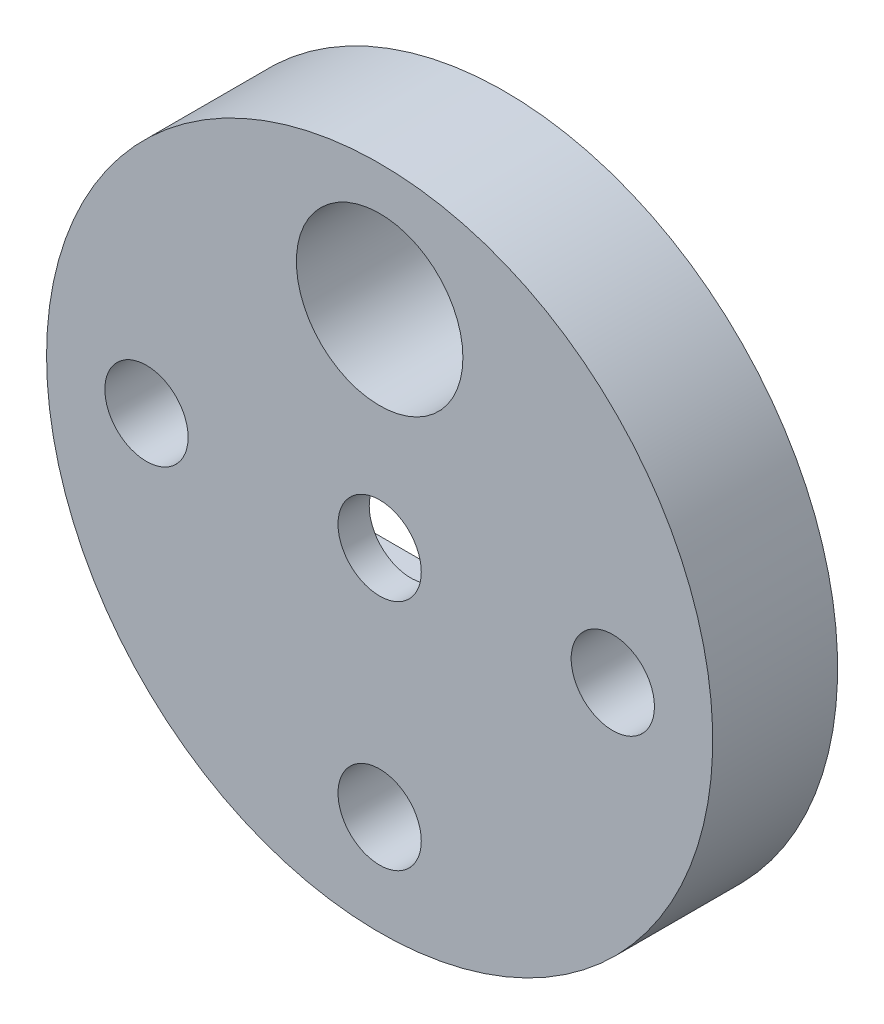
ISO-10303-21;
HEADER;
FILE_DESCRIPTION(('STEP AP214'),'2;1');
FILE_NAME('part.step','',(''),(''),'','','');
FILE_SCHEMA(('AUTOMOTIVE_DESIGN { 1 0 10303 214 1 1 1 1 }'));
ENDSEC;
DATA;
#1=APPLICATION_CONTEXT('core data for automotive mechanical design processes');
#2=APPLICATION_PROTOCOL_DEFINITION('international standard','automotive_design',2000,#1);
#3=PRODUCT_CONTEXT('',#1,'mechanical');
#4=PRODUCT('Part','Part','',(#3));
#5=PRODUCT_RELATED_PRODUCT_CATEGORY('part','',(#4));
#6=PRODUCT_DEFINITION_FORMATION('','',#4);
#7=PRODUCT_DEFINITION_CONTEXT('part definition',#1,'design');
#8=PRODUCT_DEFINITION('design','',#6,#7);
#9=PRODUCT_DEFINITION_SHAPE('','',#8);
#10=(LENGTH_UNIT() NAMED_UNIT(*) SI_UNIT(.MILLI.,.METRE.));
#11=(NAMED_UNIT(*) PLANE_ANGLE_UNIT() SI_UNIT($,.RADIAN.));
#12=(NAMED_UNIT(*) SI_UNIT($,.STERADIAN.) SOLID_ANGLE_UNIT());
#13=UNCERTAINTY_MEASURE_WITH_UNIT(LENGTH_MEASURE(1.E-05),#10,'distance_accuracy_value','');
#14=(GEOMETRIC_REPRESENTATION_CONTEXT(3) GLOBAL_UNCERTAINTY_ASSIGNED_CONTEXT((#13)) GLOBAL_UNIT_ASSIGNED_CONTEXT((#10,
#11,#12)) REPRESENTATION_CONTEXT('',''));
#15=CARTESIAN_POINT('',(0.,0.,0.));
#16=DIRECTION('',(0.,0.,1.));
#17=DIRECTION('',(1.,0.,0.));
#18=AXIS2_PLACEMENT_3D('',#15,#16,#17);
#19=CARTESIAN_POINT('',(0.,0.,0.));
#20=DIRECTION('',(0.,0.,1.));
#21=DIRECTION('',(1.,0.,0.));
#22=AXIS2_PLACEMENT_3D('',#19,#20,#21);
#23=PLANE('',#22);
#24=CARTESIAN_POINT('',(-17.78,0.,0.));
#25=DIRECTION('',(0.,0.,1.));
#26=DIRECTION('',(1.,0.,0.));
#27=AXIS2_PLACEMENT_3D('',#24,#25,#26);
#28=CIRCLE('',#27,3.175);
#29=CARTESIAN_POINT('',(-14.605,0.,0.));
#30=VERTEX_POINT('',#29);
#31=EDGE_CURVE('E198',#30,#30,#28,.T.);
#32=ORIENTED_EDGE('',*,*,#31,.T.);
#33=EDGE_LOOP('',(#32));
#34=FACE_BOUND('',#33,.T.);
#35=CARTESIAN_POINT('',(0.,15.748,0.));
#36=DIRECTION('',(0.,0.,1.));
#37=DIRECTION('',(1.,0.,0.));
#38=AXIS2_PLACEMENT_3D('',#35,#36,#37);
#39=CIRCLE('',#38,6.35);
#40=CARTESIAN_POINT('',(6.35,15.748,0.));
#41=VERTEX_POINT('',#40);
#42=EDGE_CURVE('E202',#41,#41,#39,.T.);
#43=ORIENTED_EDGE('',*,*,#42,.T.);
#44=EDGE_LOOP('',(#43));
#45=FACE_BOUND('',#44,.T.);
#46=CARTESIAN_POINT('',(17.78,0.,0.));
#47=DIRECTION('',(0.,0.,1.));
#48=DIRECTION('',(1.,0.,0.));
#49=AXIS2_PLACEMENT_3D('',#46,#47,#48);
#50=CIRCLE('',#49,3.175);
#51=CARTESIAN_POINT('',(20.955,0.,0.));
#52=VERTEX_POINT('',#51);
#53=EDGE_CURVE('E206',#52,#52,#50,.T.);
#54=ORIENTED_EDGE('',*,*,#53,.T.);
#55=EDGE_LOOP('',(#54));
#56=FACE_BOUND('',#55,.T.);
#57=CARTESIAN_POINT('',(0.,-17.7688972694278,0.));
#58=DIRECTION('',(0.,0.,1.));
#59=DIRECTION('',(1.,0.,0.));
#60=AXIS2_PLACEMENT_3D('',#57,#58,#59);
#61=CIRCLE('',#60,3.175);
#62=CARTESIAN_POINT('',(3.175,-17.7688972694278,0.));
#63=VERTEX_POINT('',#62);
#64=EDGE_CURVE('E189',#63,#63,#61,.T.);
#65=ORIENTED_EDGE('',*,*,#64,.T.);
#66=EDGE_LOOP('',(#65));
#67=FACE_BOUND('',#66,.T.);
#68=CARTESIAN_POINT('',(0.,0.,0.));
#69=DIRECTION('',(0.,0.,1.));
#70=DIRECTION('',(1.,0.,0.));
#71=AXIS2_PLACEMENT_3D('',#68,#69,#70);
#72=CIRCLE('',#71,25.4);
#73=CARTESIAN_POINT('',(-25.4,0.,0.));
#74=VERTEX_POINT('',#73);
#75=EDGE_CURVE('E43',#74,#74,#72,.T.);
#76=ORIENTED_EDGE('',*,*,#75,.F.);
#77=EDGE_LOOP('',(#76));
#78=FACE_BOUND('',#77,.T.);
#79=DIRECTION('',(0.,-1.,0.));
#80=VECTOR('',#79,1.);
#81=CARTESIAN_POINT('',(-10.31875,8.73125,0.));
#82=LINE('',#81,#80);
#83=CARTESIAN_POINT('',(-10.31875,8.73125,0.));
#84=VERTEX_POINT('',#83);
#85=CARTESIAN_POINT('',(-10.31875,-8.73125,0.));
#86=VERTEX_POINT('',#85);
#87=EDGE_CURVE('E55',#84,#86,#82,.T.);
#88=ORIENTED_EDGE('',*,*,#87,.T.);
#89=DIRECTION('',(1.,0.,0.));
#90=VECTOR('',#89,1.);
#91=CARTESIAN_POINT('',(-10.31875,-8.73125,0.));
#92=LINE('',#91,#90);
#93=CARTESIAN_POINT('',(10.31875,-8.73125,0.));
#94=VERTEX_POINT('',#93);
#95=EDGE_CURVE('E114',#86,#94,#92,.T.);
#96=ORIENTED_EDGE('',*,*,#95,.T.);
#97=DIRECTION('',(0.,-1.,0.));
#98=VECTOR('',#97,1.);
#99=CARTESIAN_POINT('',(10.31875,8.73125,0.));
#100=LINE('',#99,#98);
#101=CARTESIAN_POINT('',(10.31875,8.73125,0.));
#102=VERTEX_POINT('',#101);
#103=EDGE_CURVE('E99',#102,#94,#100,.T.);
#104=ORIENTED_EDGE('',*,*,#103,.F.);
#105=DIRECTION('',(1.,0.,0.));
#106=VECTOR('',#105,1.);
#107=CARTESIAN_POINT('',(-10.31875,8.73125,0.));
#108=LINE('',#107,#106);
#109=EDGE_CURVE('E120',#84,#102,#108,.T.);
#110=ORIENTED_EDGE('',*,*,#109,.F.);
#111=EDGE_LOOP('',(#88,#96,#104,#110));
#112=FACE_BOUND('',#111,.T.);
#113=ADVANCED_FACE('F39',(#34,#45,#56,#67,#78,#112),#23,.F.);
#114=CARTESIAN_POINT('',(0.,0.,9.525));
#115=DIRECTION('',(0.,0.,-1.));
#116=DIRECTION('',(-1.,0.,0.));
#117=AXIS2_PLACEMENT_3D('',#114,#115,#116);
#118=CYLINDRICAL_SURFACE('',#117,25.4);
#119=CARTESIAN_POINT('',(0.,0.,9.525));
#120=DIRECTION('',(0.,0.,1.));
#121=DIRECTION('',(1.,0.,0.));
#122=AXIS2_PLACEMENT_3D('',#119,#120,#121);
#123=CIRCLE('',#122,25.4);
#124=CARTESIAN_POINT('',(-25.4,0.,9.525));
#125=VERTEX_POINT('',#124);
#126=EDGE_CURVE('E11',#125,#125,#123,.T.);
#127=CARTESIAN_POINT('',(-25.4,0.,9.525));
#128=CARTESIAN_POINT('',(-25.4,0.,9.42578125));
#129=CARTESIAN_POINT('',(-25.4,0.,9.3265625));
#130=CARTESIAN_POINT('',(-25.4,0.,9.128125));
#131=CARTESIAN_POINT('',(-25.4,0.,9.02890625));
#132=CARTESIAN_POINT('',(-25.4,0.,8.83046875));
#133=CARTESIAN_POINT('',(-25.4,0.,8.73125));
#134=CARTESIAN_POINT('',(-25.4,0.,8.5328125));
#135=CARTESIAN_POINT('',(-25.4,0.,8.43359375));
#136=CARTESIAN_POINT('',(-25.4,0.,8.23515625));
#137=CARTESIAN_POINT('',(-25.4,0.,8.1359375));
#138=CARTESIAN_POINT('',(-25.4,0.,7.9375));
#139=CARTESIAN_POINT('',(-25.4,0.,7.83828125));
#140=CARTESIAN_POINT('',(-25.4,0.,7.63984375));
#141=CARTESIAN_POINT('',(-25.4,0.,7.540625));
#142=CARTESIAN_POINT('',(-25.4,0.,7.3421875));
#143=CARTESIAN_POINT('',(-25.4,0.,7.24296875));
#144=CARTESIAN_POINT('',(-25.4,0.,7.04453125));
#145=CARTESIAN_POINT('',(-25.4,0.,6.9453125));
#146=CARTESIAN_POINT('',(-25.4,0.,6.746875));
#147=CARTESIAN_POINT('',(-25.4,0.,6.64765625));
#148=CARTESIAN_POINT('',(-25.4,0.,6.44921875));
#149=CARTESIAN_POINT('',(-25.4,0.,6.35));
#150=CARTESIAN_POINT('',(-25.4,0.,6.1515625));
#151=CARTESIAN_POINT('',(-25.4,0.,6.05234375));
#152=CARTESIAN_POINT('',(-25.4,0.,5.85390625));
#153=CARTESIAN_POINT('',(-25.4,0.,5.7546875));
#154=CARTESIAN_POINT('',(-25.4,0.,5.55625));
#155=CARTESIAN_POINT('',(-25.4,0.,5.45703125));
#156=CARTESIAN_POINT('',(-25.4,0.,5.25859375));
#157=CARTESIAN_POINT('',(-25.4,0.,5.159375));
#158=CARTESIAN_POINT('',(-25.4,0.,4.9609375));
#159=CARTESIAN_POINT('',(-25.4,0.,4.86171875));
#160=CARTESIAN_POINT('',(-25.4,0.,4.66328125));
#161=CARTESIAN_POINT('',(-25.4,0.,4.5640625));
#162=CARTESIAN_POINT('',(-25.4,0.,4.365625));
#163=CARTESIAN_POINT('',(-25.4,0.,4.26640625));
#164=CARTESIAN_POINT('',(-25.4,0.,4.06796875));
#165=CARTESIAN_POINT('',(-25.4,0.,3.96875));
#166=CARTESIAN_POINT('',(-25.4,0.,3.7703125));
#167=CARTESIAN_POINT('',(-25.4,0.,3.67109375));
#168=CARTESIAN_POINT('',(-25.4,0.,3.47265625));
#169=CARTESIAN_POINT('',(-25.4,0.,3.3734375));
#170=CARTESIAN_POINT('',(-25.4,0.,3.175));
#171=CARTESIAN_POINT('',(-25.4,0.,3.07578125));
#172=CARTESIAN_POINT('',(-25.4,0.,2.87734375));
#173=CARTESIAN_POINT('',(-25.4,0.,2.778125));
#174=CARTESIAN_POINT('',(-25.4,0.,2.5796875));
#175=CARTESIAN_POINT('',(-25.4,0.,2.48046875));
#176=CARTESIAN_POINT('',(-25.4,0.,2.28203125));
#177=CARTESIAN_POINT('',(-25.4,0.,2.1828125));
#178=CARTESIAN_POINT('',(-25.4,0.,1.984375));
#179=CARTESIAN_POINT('',(-25.4,0.,1.88515625));
#180=CARTESIAN_POINT('',(-25.4,0.,1.68671875));
#181=CARTESIAN_POINT('',(-25.4,0.,1.5875));
#182=CARTESIAN_POINT('',(-25.4,0.,1.3890625));
#183=CARTESIAN_POINT('',(-25.4,0.,1.28984375));
#184=CARTESIAN_POINT('',(-25.4,0.,1.09140625));
#185=CARTESIAN_POINT('',(-25.4,0.,0.992187500000001));
#186=CARTESIAN_POINT('',(-25.4,0.,0.793750000000001));
#187=CARTESIAN_POINT('',(-25.4,0.,0.69453125));
#188=CARTESIAN_POINT('',(-25.4,0.,0.49609375));
#189=CARTESIAN_POINT('',(-25.4,0.,0.396875));
#190=CARTESIAN_POINT('',(-25.4,0.,0.1984375));
#191=CARTESIAN_POINT('',(-25.4,0.,0.0992187500000001));
#192=CARTESIAN_POINT('',(-25.4,0.,0.));
#193=B_SPLINE_CURVE_WITH_KNOTS('',3,(#127,#128,#129,#130,#131,#132,#133,#134,#135,#136,#137,
#138,#139,#140,#141,#142,#143,#144,#145,#146,#147,#148,#149,#150,#151,#152,#153,#154,#155,#156,
#157,#158,#159,#160,#161,#162,#163,#164,#165,#166,#167,#168,#169,#170,#171,#172,#173,#174,#175,
#176,#177,#178,#179,#180,#181,#182,#183,#184,#185,#186,#187,#188,#189,#190,#191,#192),
.UNSPECIFIED.,.F.,.F.,(4,2,2,2,2,2,2,2,2,2,2,2,2,2,2,2,2,2,2,2,2,2,2,2,2,2,2,2,2,2,2,2,4),(0.,
0.297656249999998,0.595312499999999,0.892968749999999,1.190625,1.48828125,1.7859375,2.08359375,
2.38125,2.67890625,2.9765625,3.27421875,3.571875,3.86953125,4.1671875,4.46484375,4.7625,
5.06015625,5.3578125,5.65546875,5.953125,6.25078125,6.5484375,6.84609375,7.14375,7.44140625,
7.7390625,8.03671875,8.334375,8.63203125,8.9296875,9.22734375,9.525),.UNSPECIFIED.);
#194=EDGE_CURVE('BSEAM41',#125,#74,#193,.T.);
#195=ORIENTED_EDGE('',*,*,#126,.F.);
#196=ORIENTED_EDGE('',*,*,#75,.T.);
#197=ORIENTED_EDGE('',*,*,#194,.T.);
#198=ORIENTED_EDGE('',*,*,#194,.F.);
#199=EDGE_LOOP('',(#195,#197,#196,#198));
#200=FACE_BOUND('',#199,.T.);
#201=ADVANCED_FACE('F41',(#200),#118,.T.);
#202=CARTESIAN_POINT('',(0.,0.,9.525));
#203=DIRECTION('',(0.,0.,1.));
#204=DIRECTION('',(1.,0.,0.));
#205=AXIS2_PLACEMENT_3D('',#202,#203,#204);
#206=PLANE('',#205);
#207=CARTESIAN_POINT('',(-17.78,0.,9.525));
#208=DIRECTION('',(0.,0.,1.));
#209=DIRECTION('',(1.,0.,0.));
#210=AXIS2_PLACEMENT_3D('',#207,#208,#209);
#211=CIRCLE('',#210,3.175);
#212=CARTESIAN_POINT('',(-14.605,0.,9.525));
#213=VERTEX_POINT('',#212);
#214=EDGE_CURVE('E166',#213,#213,#211,.T.);
#215=ORIENTED_EDGE('',*,*,#214,.F.);
#216=EDGE_LOOP('',(#215));
#217=FACE_BOUND('',#216,.T.);
#218=CARTESIAN_POINT('',(0.,15.748,9.525));
#219=DIRECTION('',(0.,0.,1.));
#220=DIRECTION('',(1.,0.,0.));
#221=AXIS2_PLACEMENT_3D('',#218,#219,#220);
#222=CIRCLE('',#221,6.35);
#223=CARTESIAN_POINT('',(6.35,15.748,9.525));
#224=VERTEX_POINT('',#223);
#225=EDGE_CURVE('E170',#224,#224,#222,.T.);
#226=ORIENTED_EDGE('',*,*,#225,.F.);
#227=EDGE_LOOP('',(#226));
#228=FACE_BOUND('',#227,.T.);
#229=CARTESIAN_POINT('',(17.78,0.,9.525));
#230=DIRECTION('',(0.,0.,1.));
#231=DIRECTION('',(1.,0.,0.));
#232=AXIS2_PLACEMENT_3D('',#229,#230,#231);
#233=CIRCLE('',#232,3.175);
#234=CARTESIAN_POINT('',(20.955,0.,9.525));
#235=VERTEX_POINT('',#234);
#236=EDGE_CURVE('E174',#235,#235,#233,.T.);
#237=ORIENTED_EDGE('',*,*,#236,.F.);
#238=EDGE_LOOP('',(#237));
#239=FACE_BOUND('',#238,.T.);
#240=CARTESIAN_POINT('',(0.,-17.7688972694278,9.525));
#241=DIRECTION('',(0.,0.,1.));
#242=DIRECTION('',(1.,0.,0.));
#243=AXIS2_PLACEMENT_3D('',#240,#241,#242);
#244=CIRCLE('',#243,3.175);
#245=CARTESIAN_POINT('',(3.175,-17.7688972694278,9.525));
#246=VERTEX_POINT('',#245);
#247=EDGE_CURVE('E178',#246,#246,#244,.T.);
#248=ORIENTED_EDGE('',*,*,#247,.F.);
#249=EDGE_LOOP('',(#248));
#250=FACE_BOUND('',#249,.T.);
#251=CARTESIAN_POINT('',(0.,0.,9.525));
#252=DIRECTION('',(0.,0.,1.));
#253=DIRECTION('',(1.,0.,0.));
#254=AXIS2_PLACEMENT_3D('',#251,#252,#253);
#255=CIRCLE('',#254,3.175);
#256=CARTESIAN_POINT('',(3.175,0.,9.525));
#257=VERTEX_POINT('',#256);
#258=EDGE_CURVE('E115',#257,#257,#255,.T.);
#259=ORIENTED_EDGE('',*,*,#258,.F.);
#260=EDGE_LOOP('',(#259));
#261=FACE_BOUND('',#260,.T.);
#262=ORIENTED_EDGE('',*,*,#126,.T.);
#263=EDGE_LOOP('',(#262));
#264=FACE_BOUND('',#263,.T.);
#265=ADVANCED_FACE('F156',(#217,#228,#239,#250,#261,#264),#206,.T.);
#266=CARTESIAN_POINT('',(-10.31875,8.73125,7.14375));
#267=DIRECTION('',(1.,0.,0.));
#268=DIRECTION('',(0.,1.,0.));
#269=AXIS2_PLACEMENT_3D('',#266,#267,#268);
#270=PLANE('',#269);
#271=ORIENTED_EDGE('',*,*,#87,.F.);
#272=DIRECTION('',(0.,0.,-1.));
#273=VECTOR('',#272,1.);
#274=CARTESIAN_POINT('',(-10.31875,8.73125,7.14375));
#275=LINE('',#274,#273);
#276=CARTESIAN_POINT('',(-10.31875,8.73125,7.14375));
#277=VERTEX_POINT('',#276);
#278=EDGE_CURVE('E60',#277,#84,#275,.T.);
#279=ORIENTED_EDGE('',*,*,#278,.F.);
#280=DIRECTION('',(0.,-1.,0.));
#281=VECTOR('',#280,1.);
#282=CARTESIAN_POINT('',(-10.31875,8.73125,7.14375));
#283=LINE('',#282,#281);
#284=CARTESIAN_POINT('',(-10.31875,-8.73125,7.14375));
#285=VERTEX_POINT('',#284);
#286=EDGE_CURVE('E94',#277,#285,#283,.T.);
#287=ORIENTED_EDGE('',*,*,#286,.T.);
#288=DIRECTION('',(0.,0.,-1.));
#289=VECTOR('',#288,1.);
#290=CARTESIAN_POINT('',(-10.31875,-8.73125,7.14375));
#291=LINE('',#290,#289);
#292=EDGE_CURVE('E91',#285,#86,#291,.T.);
#293=ORIENTED_EDGE('',*,*,#292,.T.);
#294=EDGE_LOOP('',(#271,#279,#287,#293));
#295=FACE_BOUND('',#294,.T.);
#296=ADVANCED_FACE('F153',(#295),#270,.T.);
#297=CARTESIAN_POINT('',(-10.31875,-8.73125,7.14375));
#298=DIRECTION('',(0.,1.,0.));
#299=DIRECTION('',(0.,0.,1.));
#300=AXIS2_PLACEMENT_3D('',#297,#298,#299);
#301=PLANE('',#300);
#302=ORIENTED_EDGE('',*,*,#95,.F.);
#303=ORIENTED_EDGE('',*,*,#292,.F.);
#304=DIRECTION('',(1.,0.,0.));
#305=VECTOR('',#304,1.);
#306=CARTESIAN_POINT('',(-10.31875,-8.73125,7.14375));
#307=LINE('',#306,#305);
#308=CARTESIAN_POINT('',(10.31875,-8.73125,7.14375));
#309=VERTEX_POINT('',#308);
#310=EDGE_CURVE('E85',#285,#309,#307,.T.);
#311=ORIENTED_EDGE('',*,*,#310,.T.);
#312=DIRECTION('',(0.,0.,-1.));
#313=VECTOR('',#312,1.);
#314=CARTESIAN_POINT('',(10.31875,-8.73125,7.14375));
#315=LINE('',#314,#313);
#316=EDGE_CURVE('E90',#309,#94,#315,.T.);
#317=ORIENTED_EDGE('',*,*,#316,.T.);
#318=EDGE_LOOP('',(#302,#303,#311,#317));
#319=FACE_BOUND('',#318,.T.);
#320=ADVANCED_FACE('F89',(#319),#301,.T.);
#321=CARTESIAN_POINT('',(10.31875,8.73125,7.14375));
#322=DIRECTION('',(1.,0.,0.));
#323=DIRECTION('',(0.,1.,0.));
#324=AXIS2_PLACEMENT_3D('',#321,#322,#323);
#325=PLANE('',#324);
#326=ORIENTED_EDGE('',*,*,#103,.T.);
#327=ORIENTED_EDGE('',*,*,#316,.F.);
#328=DIRECTION('',(0.,-1.,0.));
#329=VECTOR('',#328,1.);
#330=CARTESIAN_POINT('',(10.31875,8.73125,7.14375));
#331=LINE('',#330,#329);
#332=CARTESIAN_POINT('',(10.31875,8.73125,7.14375));
#333=VERTEX_POINT('',#332);
#334=EDGE_CURVE('E93',#333,#309,#331,.T.);
#335=ORIENTED_EDGE('',*,*,#334,.F.);
#336=DIRECTION('',(0.,0.,-1.));
#337=VECTOR('',#336,1.);
#338=CARTESIAN_POINT('',(10.31875,8.73125,7.14375));
#339=LINE('',#338,#337);
#340=EDGE_CURVE('E78',#333,#102,#339,.T.);
#341=ORIENTED_EDGE('',*,*,#340,.T.);
#342=EDGE_LOOP('',(#326,#327,#335,#341));
#343=FACE_BOUND('',#342,.T.);
#344=ADVANCED_FACE('F96',(#343),#325,.F.);
#345=CARTESIAN_POINT('',(-10.31875,8.73125,7.14375));
#346=DIRECTION('',(0.,1.,0.));
#347=DIRECTION('',(0.,0.,1.));
#348=AXIS2_PLACEMENT_3D('',#345,#346,#347);
#349=PLANE('',#348);
#350=ORIENTED_EDGE('',*,*,#109,.T.);
#351=ORIENTED_EDGE('',*,*,#340,.F.);
#352=DIRECTION('',(1.,0.,0.));
#353=VECTOR('',#352,1.);
#354=CARTESIAN_POINT('',(-10.31875,8.73125,7.14375));
#355=LINE('',#354,#353);
#356=EDGE_CURVE('E105',#277,#333,#355,.T.);
#357=ORIENTED_EDGE('',*,*,#356,.F.);
#358=ORIENTED_EDGE('',*,*,#278,.T.);
#359=EDGE_LOOP('',(#350,#351,#357,#358));
#360=FACE_BOUND('',#359,.T.);
#361=ADVANCED_FACE('F138',(#360),#349,.F.);
#362=CARTESIAN_POINT('',(0.,0.,7.14375));
#363=DIRECTION('',(0.,0.,1.));
#364=DIRECTION('',(1.,0.,0.));
#365=AXIS2_PLACEMENT_3D('',#362,#363,#364);
#366=PLANE('',#365);
#367=CARTESIAN_POINT('',(0.,0.,7.14375));
#368=DIRECTION('',(0.,0.,-1.));
#369=DIRECTION('',(-1.,0.,0.));
#370=AXIS2_PLACEMENT_3D('',#367,#368,#369);
#371=CIRCLE('',#370,3.175);
#372=CARTESIAN_POINT('',(-3.175,0.,7.14375));
#373=VERTEX_POINT('',#372);
#374=EDGE_CURVE('E185',#373,#373,#371,.T.);
#375=ORIENTED_EDGE('',*,*,#374,.F.);
#376=EDGE_LOOP('',(#375));
#377=FACE_BOUND('',#376,.T.);
#378=ORIENTED_EDGE('',*,*,#286,.F.);
#379=ORIENTED_EDGE('',*,*,#356,.T.);
#380=ORIENTED_EDGE('',*,*,#334,.T.);
#381=ORIENTED_EDGE('',*,*,#310,.F.);
#382=EDGE_LOOP('',(#378,#379,#380,#381));
#383=FACE_BOUND('',#382,.T.);
#384=ADVANCED_FACE('F103',(#377,#383),#366,.F.);
#385=CARTESIAN_POINT('',(0.,0.,22.70125));
#386=DIRECTION('',(0.,0.,-1.));
#387=DIRECTION('',(-1.,0.,0.));
#388=AXIS2_PLACEMENT_3D('',#385,#386,#387);
#389=CYLINDRICAL_SURFACE('',#388,3.175);
#390=ORIENTED_EDGE('',*,*,#258,.T.);
#391=EDGE_LOOP('',(#390));
#392=FACE_BOUND('',#391,.T.);
#393=ORIENTED_EDGE('',*,*,#374,.T.);
#394=EDGE_LOOP('',(#393));
#395=FACE_BOUND('',#394,.T.);
#396=ADVANCED_FACE('F145',(#392,#395),#389,.F.);
#397=CARTESIAN_POINT('',(0.,-17.7688972694278,-6.0325));
#398=DIRECTION('',(0.,0.,1.));
#399=DIRECTION('',(1.,0.,0.));
#400=AXIS2_PLACEMENT_3D('',#397,#398,#399);
#401=CYLINDRICAL_SURFACE('',#400,3.175);
#402=ORIENTED_EDGE('',*,*,#247,.T.);
#403=EDGE_LOOP('',(#402));
#404=FACE_BOUND('',#403,.T.);
#405=ORIENTED_EDGE('',*,*,#64,.F.);
#406=EDGE_LOOP('',(#405));
#407=FACE_BOUND('',#406,.T.);
#408=ADVANCED_FACE('F229',(#404,#407),#401,.F.);
#409=CARTESIAN_POINT('',(17.78,0.,-6.0325));
#410=DIRECTION('',(0.,0.,1.));
#411=DIRECTION('',(1.,0.,0.));
#412=AXIS2_PLACEMENT_3D('',#409,#410,#411);
#413=CYLINDRICAL_SURFACE('',#412,3.175);
#414=ORIENTED_EDGE('',*,*,#236,.T.);
#415=EDGE_LOOP('',(#414));
#416=FACE_BOUND('',#415,.T.);
#417=ORIENTED_EDGE('',*,*,#53,.F.);
#418=EDGE_LOOP('',(#417));
#419=FACE_BOUND('',#418,.T.);
#420=ADVANCED_FACE('F231',(#416,#419),#413,.F.);
#421=CARTESIAN_POINT('',(0.,15.748,-6.0325));
#422=DIRECTION('',(0.,0.,1.));
#423=DIRECTION('',(1.,0.,0.));
#424=AXIS2_PLACEMENT_3D('',#421,#422,#423);
#425=CYLINDRICAL_SURFACE('',#424,6.35);
#426=ORIENTED_EDGE('',*,*,#225,.T.);
#427=EDGE_LOOP('',(#426));
#428=FACE_BOUND('',#427,.T.);
#429=ORIENTED_EDGE('',*,*,#42,.F.);
#430=EDGE_LOOP('',(#429));
#431=FACE_BOUND('',#430,.T.);
#432=ADVANCED_FACE('F219',(#428,#431),#425,.F.);
#433=CARTESIAN_POINT('',(-17.78,0.,-6.0325));
#434=DIRECTION('',(0.,0.,1.));
#435=DIRECTION('',(1.,0.,0.));
#436=AXIS2_PLACEMENT_3D('',#433,#434,#435);
#437=CYLINDRICAL_SURFACE('',#436,3.175);
#438=ORIENTED_EDGE('',*,*,#214,.T.);
#439=EDGE_LOOP('',(#438));
#440=FACE_BOUND('',#439,.T.);
#441=ORIENTED_EDGE('',*,*,#31,.F.);
#442=EDGE_LOOP('',(#441));
#443=FACE_BOUND('',#442,.T.);
#444=ADVANCED_FACE('F216',(#440,#443),#437,.F.);
#445=CLOSED_SHELL('',(#113,#201,#265,#296,#320,#344,#361,#384,#396,#408,#420,#432,#444));
#446=MANIFOLD_SOLID_BREP('B2',#445);
#447=ADVANCED_BREP_SHAPE_REPRESENTATION('',(#18,#446),#14);
#448=SHAPE_DEFINITION_REPRESENTATION(#9,#447);
ENDSEC;
END-ISO-10303-21;
